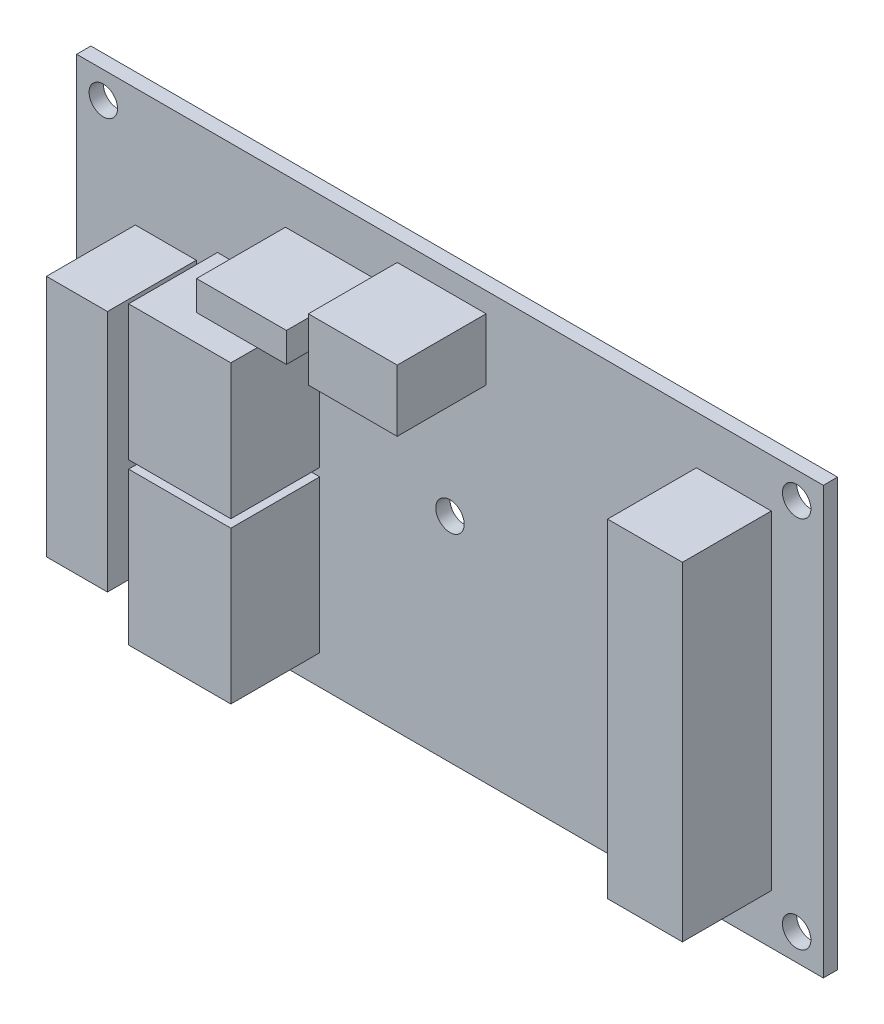
ISO-10303-21;
HEADER;
FILE_DESCRIPTION(('STEP AP214'),'2;1');
FILE_NAME('part.step','',(''),(''),'','','');
FILE_SCHEMA(('AUTOMOTIVE_DESIGN { 1 0 10303 214 1 1 1 1 }'));
ENDSEC;
DATA;
#1=APPLICATION_CONTEXT('core data for automotive mechanical design processes');
#2=APPLICATION_PROTOCOL_DEFINITION('international standard','automotive_design',2000,#1);
#3=PRODUCT_CONTEXT('',#1,'mechanical');
#4=PRODUCT('Part','Part','',(#3));
#5=PRODUCT_RELATED_PRODUCT_CATEGORY('part','',(#4));
#6=PRODUCT_DEFINITION_FORMATION('','',#4);
#7=PRODUCT_DEFINITION_CONTEXT('part definition',#1,'design');
#8=PRODUCT_DEFINITION('design','',#6,#7);
#9=PRODUCT_DEFINITION_SHAPE('','',#8);
#10=(LENGTH_UNIT() NAMED_UNIT(*) SI_UNIT(.MILLI.,.METRE.));
#11=(NAMED_UNIT(*) PLANE_ANGLE_UNIT() SI_UNIT($,.RADIAN.));
#12=(NAMED_UNIT(*) SI_UNIT($,.STERADIAN.) SOLID_ANGLE_UNIT());
#13=UNCERTAINTY_MEASURE_WITH_UNIT(LENGTH_MEASURE(1.E-05),#10,'distance_accuracy_value','');
#14=(GEOMETRIC_REPRESENTATION_CONTEXT(3) GLOBAL_UNCERTAINTY_ASSIGNED_CONTEXT((#13)) GLOBAL_UNIT_ASSIGNED_CONTEXT((#10,
#11,#12)) REPRESENTATION_CONTEXT('',''));
#15=CARTESIAN_POINT('',(0.,0.,0.));
#16=DIRECTION('',(0.,0.,1.));
#17=DIRECTION('',(1.,0.,0.));
#18=AXIS2_PLACEMENT_3D('',#15,#16,#17);
#19=CARTESIAN_POINT('',(0.,0.,0.8));
#20=DIRECTION('',(0.,0.,1.));
#21=DIRECTION('',(1.,0.,0.));
#22=AXIS2_PLACEMENT_3D('',#19,#20,#21);
#23=PLANE('',#22);
#24=CARTESIAN_POINT('',(-39.,21.,0.8));
#25=DIRECTION('',(0.,0.,1.));
#26=DIRECTION('',(1.,0.,0.));
#27=AXIS2_PLACEMENT_3D('',#24,#25,#26);
#28=CIRCLE('',#27,1.6);
#29=CARTESIAN_POINT('',(-37.4,21.,0.8));
#30=VERTEX_POINT('',#29);
#31=EDGE_CURVE('E395',#30,#30,#28,.T.);
#32=ORIENTED_EDGE('',*,*,#31,.F.);
#33=EDGE_LOOP('',(#32));
#34=FACE_BOUND('',#33,.T.);
#35=CARTESIAN_POINT('',(0.,0.,0.8));
#36=DIRECTION('',(0.,0.,1.));
#37=DIRECTION('',(1.,0.,0.));
#38=AXIS2_PLACEMENT_3D('',#35,#36,#37);
#39=CIRCLE('',#38,1.6);
#40=CARTESIAN_POINT('',(1.6,0.,0.8));
#41=VERTEX_POINT('',#40);
#42=EDGE_CURVE('E401',#41,#41,#39,.T.);
#43=ORIENTED_EDGE('',*,*,#42,.F.);
#44=EDGE_LOOP('',(#43));
#45=FACE_BOUND('',#44,.T.);
#46=CARTESIAN_POINT('',(39.,21.,0.8));
#47=DIRECTION('',(0.,0.,1.));
#48=DIRECTION('',(1.,0.,0.));
#49=AXIS2_PLACEMENT_3D('',#46,#47,#48);
#50=CIRCLE('',#49,1.6);
#51=CARTESIAN_POINT('',(40.6,21.,0.8));
#52=VERTEX_POINT('',#51);
#53=EDGE_CURVE('E407',#52,#52,#50,.T.);
#54=ORIENTED_EDGE('',*,*,#53,.F.);
#55=EDGE_LOOP('',(#54));
#56=FACE_BOUND('',#55,.T.);
#57=CARTESIAN_POINT('',(39.,-21.,0.8));
#58=DIRECTION('',(0.,0.,1.));
#59=DIRECTION('',(1.,0.,0.));
#60=AXIS2_PLACEMENT_3D('',#57,#58,#59);
#61=CIRCLE('',#60,1.6);
#62=CARTESIAN_POINT('',(40.6,-21.,0.8));
#63=VERTEX_POINT('',#62);
#64=EDGE_CURVE('E390',#63,#63,#61,.T.);
#65=ORIENTED_EDGE('',*,*,#64,.F.);
#66=EDGE_LOOP('',(#65));
#67=FACE_BOUND('',#66,.T.);
#68=CARTESIAN_POINT('',(-39.,-21.,0.8));
#69=DIRECTION('',(0.,0.,1.));
#70=DIRECTION('',(1.,0.,0.));
#71=AXIS2_PLACEMENT_3D('',#68,#69,#70);
#72=CIRCLE('',#71,1.6);
#73=CARTESIAN_POINT('',(-37.4,-21.,0.8));
#74=VERTEX_POINT('',#73);
#75=EDGE_CURVE('E394',#74,#74,#72,.T.);
#76=ORIENTED_EDGE('',*,*,#75,.F.);
#77=EDGE_LOOP('',(#76));
#78=FACE_BOUND('',#77,.T.);
#79=DIRECTION('',(0.,-1.,0.));
#80=VECTOR('',#79,1.);
#81=CARTESIAN_POINT('',(-42.,24.,0.8));
#82=LINE('',#81,#80);
#83=CARTESIAN_POINT('',(-42.,24.,0.8));
#84=VERTEX_POINT('',#83);
#85=CARTESIAN_POINT('',(-42.,-24.,0.8));
#86=VERTEX_POINT('',#85);
#87=EDGE_CURVE('E421',#84,#86,#82,.T.);
#88=ORIENTED_EDGE('',*,*,#87,.T.);
#89=DIRECTION('',(1.,0.,0.));
#90=VECTOR('',#89,1.);
#91=CARTESIAN_POINT('',(-42.,-24.,0.8));
#92=LINE('',#91,#90);
#93=CARTESIAN_POINT('',(42.,-24.,0.8));
#94=VERTEX_POINT('',#93);
#95=EDGE_CURVE('E424',#86,#94,#92,.T.);
#96=ORIENTED_EDGE('',*,*,#95,.T.);
#97=DIRECTION('',(0.,1.,0.));
#98=VECTOR('',#97,1.);
#99=CARTESIAN_POINT('',(42.,24.,0.8));
#100=LINE('',#99,#98);
#101=CARTESIAN_POINT('',(42.,24.,0.8));
#102=VERTEX_POINT('',#101);
#103=EDGE_CURVE('E427',#94,#102,#100,.T.);
#104=ORIENTED_EDGE('',*,*,#103,.T.);
#105=DIRECTION('',(-1.,0.,0.));
#106=VECTOR('',#105,1.);
#107=CARTESIAN_POINT('',(-42.,24.,0.8));
#108=LINE('',#107,#106);
#109=EDGE_CURVE('E429',#102,#84,#108,.T.);
#110=ORIENTED_EDGE('',*,*,#109,.T.);
#111=EDGE_LOOP('',(#88,#96,#104,#110));
#112=FACE_BOUND('',#111,.T.);
#113=DIRECTION('',(1.,0.,0.));
#114=VECTOR('',#113,1.);
#115=CARTESIAN_POINT('',(-35.397250685937,-16.6681885271844,0.8));
#116=LINE('',#115,#114);
#117=CARTESIAN_POINT('',(-35.397250685937,-16.6681885271844,0.8));
#118=VERTEX_POINT('',#117);
#119=CARTESIAN_POINT('',(-28.5351315170392,-16.6681885271844,0.8));
#120=VERTEX_POINT('',#119);
#121=EDGE_CURVE('E375',#118,#120,#116,.T.);
#122=ORIENTED_EDGE('',*,*,#121,.F.);
#123=DIRECTION('',(0.,-1.,0.));
#124=VECTOR('',#123,1.);
#125=CARTESIAN_POINT('',(-35.397250685937,-16.6681885271844,0.8));
#126=LINE('',#125,#124);
#127=CARTESIAN_POINT('',(-35.397250685937,10.6639361750477,0.8));
#128=VERTEX_POINT('',#127);
#129=EDGE_CURVE('E361',#128,#118,#126,.T.);
#130=ORIENTED_EDGE('',*,*,#129,.F.);
#131=DIRECTION('',(-1.,0.,0.));
#132=VECTOR('',#131,1.);
#133=CARTESIAN_POINT('',(-35.397250685937,10.6639361750477,0.8));
#134=LINE('',#133,#132);
#135=CARTESIAN_POINT('',(-28.5351315170392,10.6639361750477,0.8));
#136=VERTEX_POINT('',#135);
#137=EDGE_CURVE('E366',#136,#128,#134,.T.);
#138=ORIENTED_EDGE('',*,*,#137,.F.);
#139=DIRECTION('',(0.,1.,0.));
#140=VECTOR('',#139,1.);
#141=CARTESIAN_POINT('',(-28.5351315170392,-16.6681885271844,0.8));
#142=LINE('',#141,#140);
#143=EDGE_CURVE('E377',#120,#136,#142,.T.);
#144=ORIENTED_EDGE('',*,*,#143,.F.);
#145=EDGE_LOOP('',(#122,#130,#138,#144));
#146=FACE_BOUND('',#145,.T.);
#147=DIRECTION('',(1.,0.,0.));
#148=VECTOR('',#147,1.);
#149=CARTESIAN_POINT('',(-18.5116651227524,15.5760843348832,0.8));
#150=LINE('',#149,#148);
#151=CARTESIAN_POINT('',(-18.5116651227524,15.5760843348832,0.8));
#152=VERTEX_POINT('',#151);
#153=CARTESIAN_POINT('',(-8.40103586189882,15.5760843348832,0.8));
#154=VERTEX_POINT('',#153);
#155=EDGE_CURVE('E346',#152,#154,#150,.T.);
#156=ORIENTED_EDGE('',*,*,#155,.F.);
#157=DIRECTION('',(0.,-1.,0.));
#158=VECTOR('',#157,1.);
#159=CARTESIAN_POINT('',(-18.5116651227524,15.5760843348832,0.8));
#160=LINE('',#159,#158);
#161=CARTESIAN_POINT('',(-18.5116651227524,18.8889284426793,0.8));
#162=VERTEX_POINT('',#161);
#163=EDGE_CURVE('E332',#162,#152,#160,.T.);
#164=ORIENTED_EDGE('',*,*,#163,.F.);
#165=DIRECTION('',(-1.,0.,0.));
#166=VECTOR('',#165,1.);
#167=CARTESIAN_POINT('',(-18.5116651227524,18.8889284426793,0.8));
#168=LINE('',#167,#166);
#169=CARTESIAN_POINT('',(-8.40103586189882,18.8889284426793,0.8));
#170=VERTEX_POINT('',#169);
#171=EDGE_CURVE('E337',#170,#162,#168,.T.);
#172=ORIENTED_EDGE('',*,*,#171,.F.);
#173=DIRECTION('',(0.,1.,0.));
#174=VECTOR('',#173,1.);
#175=CARTESIAN_POINT('',(-8.40103586189882,15.5760843348832,0.8));
#176=LINE('',#175,#174);
#177=EDGE_CURVE('E348',#154,#170,#176,.T.);
#178=ORIENTED_EDGE('',*,*,#177,.F.);
#179=EDGE_LOOP('',(#156,#164,#172,#178));
#180=FACE_BOUND('',#179,.T.);
#181=DIRECTION('',(1.,0.,0.));
#182=VECTOR('',#181,1.);
#183=CARTESIAN_POINT('',(-5.93226889267909,14.801458918146,0.8));
#184=LINE('',#183,#182);
#185=CARTESIAN_POINT('',(-5.93226889267909,14.801458918146,0.8));
#186=VERTEX_POINT('',#185);
#187=CARTESIAN_POINT('',(4.06338143256795,14.801458918146,0.8));
#188=VERTEX_POINT('',#187);
#189=EDGE_CURVE('E317',#186,#188,#184,.T.);
#190=ORIENTED_EDGE('',*,*,#189,.F.);
#191=DIRECTION('',(0.,-1.,0.));
#192=VECTOR('',#191,1.);
#193=CARTESIAN_POINT('',(-5.93226889267909,14.801458918146,0.8));
#194=LINE('',#193,#192);
#195=CARTESIAN_POINT('',(-5.93226889267909,21.7448285356069,0.8));
#196=VERTEX_POINT('',#195);
#197=EDGE_CURVE('E303',#196,#186,#194,.T.);
#198=ORIENTED_EDGE('',*,*,#197,.F.);
#199=DIRECTION('',(-1.,0.,0.));
#200=VECTOR('',#199,1.);
#201=CARTESIAN_POINT('',(-5.93226889267909,21.7448285356069,0.8));
#202=LINE('',#201,#200);
#203=CARTESIAN_POINT('',(4.06338143256795,21.7448285356069,0.8));
#204=VERTEX_POINT('',#203);
#205=EDGE_CURVE('E308',#204,#196,#202,.T.);
#206=ORIENTED_EDGE('',*,*,#205,.F.);
#207=DIRECTION('',(0.,1.,0.));
#208=VECTOR('',#207,1.);
#209=CARTESIAN_POINT('',(4.06338143256795,14.801458918146,0.8));
#210=LINE('',#209,#208);
#211=EDGE_CURVE('E319',#188,#204,#210,.T.);
#212=ORIENTED_EDGE('',*,*,#211,.F.);
#213=EDGE_LOOP('',(#190,#198,#206,#212));
#214=FACE_BOUND('',#213,.T.);
#215=DIRECTION('',(1.,0.,0.));
#216=VECTOR('',#215,1.);
#217=CARTESIAN_POINT('',(-26.155214772933,-20.6367288434401,0.8));
#218=LINE('',#217,#216);
#219=CARTESIAN_POINT('',(-26.155214772933,-20.6367288434401,0.8));
#220=VERTEX_POINT('',#219);
#221=CARTESIAN_POINT('',(-14.6522838430851,-20.6367288434401,0.8));
#222=VERTEX_POINT('',#221);
#223=EDGE_CURVE('E288',#220,#222,#218,.T.);
#224=ORIENTED_EDGE('',*,*,#223,.F.);
#225=DIRECTION('',(0.,-1.,0.));
#226=VECTOR('',#225,1.);
#227=CARTESIAN_POINT('',(-26.155214772933,-20.6367288434401,0.8));
#228=LINE('',#227,#226);
#229=CARTESIAN_POINT('',(-26.155214772933,-3.50132828587382,0.8));
#230=VERTEX_POINT('',#229);
#231=EDGE_CURVE('E274',#230,#220,#228,.T.);
#232=ORIENTED_EDGE('',*,*,#231,.F.);
#233=DIRECTION('',(-1.,0.,0.));
#234=VECTOR('',#233,1.);
#235=CARTESIAN_POINT('',(-26.155214772933,-3.50132828587382,0.8));
#236=LINE('',#235,#234);
#237=CARTESIAN_POINT('',(-14.6522838430851,-3.50132828587382,0.8));
#238=VERTEX_POINT('',#237);
#239=EDGE_CURVE('E279',#238,#230,#236,.T.);
#240=ORIENTED_EDGE('',*,*,#239,.F.);
#241=DIRECTION('',(0.,1.,0.));
#242=VECTOR('',#241,1.);
#243=CARTESIAN_POINT('',(-14.6522838430851,-20.6367288434401,0.8));
#244=LINE('',#243,#242);
#245=EDGE_CURVE('E290',#222,#238,#244,.T.);
#246=ORIENTED_EDGE('',*,*,#245,.F.);
#247=EDGE_LOOP('',(#224,#232,#240,#246));
#248=FACE_BOUND('',#247,.T.);
#249=DIRECTION('',(1.,0.,0.));
#250=VECTOR('',#249,1.);
#251=CARTESIAN_POINT('',(-26.1552147729329,-2.58744025613696,0.8));
#252=LINE('',#251,#250);
#253=CARTESIAN_POINT('',(-26.1552147729329,-2.58744025613696,0.8));
#254=VERTEX_POINT('',#253);
#255=CARTESIAN_POINT('',(-14.6522838430851,-2.58744025613696,0.8));
#256=VERTEX_POINT('',#255);
#257=EDGE_CURVE('E246',#254,#256,#252,.T.);
#258=ORIENTED_EDGE('',*,*,#257,.F.);
#259=DIRECTION('',(0.,-1.,0.));
#260=VECTOR('',#259,1.);
#261=CARTESIAN_POINT('',(-26.1552147729329,-2.58744025613696,0.8));
#262=LINE('',#261,#260);
#263=CARTESIAN_POINT('',(-26.1552147729329,12.6059482382385,0.8));
#264=VERTEX_POINT('',#263);
#265=EDGE_CURVE('E243',#264,#254,#262,.T.);
#266=ORIENTED_EDGE('',*,*,#265,.F.);
#267=DIRECTION('',(-1.,0.,0.));
#268=VECTOR('',#267,1.);
#269=CARTESIAN_POINT('',(-26.1552147729329,12.6059482382385,0.8));
#270=LINE('',#269,#268);
#271=CARTESIAN_POINT('',(-14.6522838430851,12.6059482382385,0.8));
#272=VERTEX_POINT('',#271);
#273=EDGE_CURVE('E255',#272,#264,#270,.T.);
#274=ORIENTED_EDGE('',*,*,#273,.F.);
#275=DIRECTION('',(0.,1.,0.));
#276=VECTOR('',#275,1.);
#277=CARTESIAN_POINT('',(-14.6522838430851,-2.58744025613696,0.8));
#278=LINE('',#277,#276);
#279=EDGE_CURVE('E263',#256,#272,#278,.T.);
#280=ORIENTED_EDGE('',*,*,#279,.F.);
#281=EDGE_LOOP('',(#258,#266,#274,#280));
#282=FACE_BOUND('',#281,.T.);
#283=DIRECTION('',(1.,0.,0.));
#284=VECTOR('',#283,1.);
#285=CARTESIAN_POINT('',(27.7283273445288,-18.4133300847137,0.8));
#286=LINE('',#285,#284);
#287=CARTESIAN_POINT('',(27.7283273445288,-18.4133300847137,0.8));
#288=VERTEX_POINT('',#287);
#289=CARTESIAN_POINT('',(36.1489259213258,-18.4133300847137,0.8));
#290=VERTEX_POINT('',#289);
#291=EDGE_CURVE('E864',#288,#290,#286,.T.);
#292=ORIENTED_EDGE('',*,*,#291,.F.);
#293=DIRECTION('',(0.,-1.,0.));
#294=VECTOR('',#293,1.);
#295=CARTESIAN_POINT('',(27.7283273445288,-18.4133300847137,0.8));
#296=LINE('',#295,#294);
#297=CARTESIAN_POINT('',(27.7283273445288,18.5743459068227,0.8));
#298=VERTEX_POINT('',#297);
#299=EDGE_CURVE('E241',#298,#288,#296,.T.);
#300=ORIENTED_EDGE('',*,*,#299,.F.);
#301=DIRECTION('',(-1.,0.,0.));
#302=VECTOR('',#301,1.);
#303=CARTESIAN_POINT('',(27.7283273445288,18.5743459068227,0.8));
#304=LINE('',#303,#302);
#305=CARTESIAN_POINT('',(36.1489259213258,18.5743459068227,0.8));
#306=VERTEX_POINT('',#305);
#307=EDGE_CURVE('E237',#306,#298,#304,.T.);
#308=ORIENTED_EDGE('',*,*,#307,.F.);
#309=DIRECTION('',(0.,1.,0.));
#310=VECTOR('',#309,1.);
#311=CARTESIAN_POINT('',(36.1489259213258,-18.4133300847137,0.8));
#312=LINE('',#311,#310);
#313=EDGE_CURVE('E861',#290,#306,#312,.T.);
#314=ORIENTED_EDGE('',*,*,#313,.F.);
#315=EDGE_LOOP('',(#292,#300,#308,#314));
#316=FACE_BOUND('',#315,.T.);
#317=ADVANCED_FACE('F32',(#34,#45,#56,#67,#78,#112,#146,#180,#214,#248,#282,#316),#23,.T.);
#318=CARTESIAN_POINT('',(-42.,24.,0.8));
#319=DIRECTION('',(1.,0.,0.));
#320=DIRECTION('',(0.,1.,0.));
#321=AXIS2_PLACEMENT_3D('',#318,#319,#320);
#322=PLANE('',#321);
#323=DIRECTION('',(0.,-1.,0.));
#324=VECTOR('',#323,1.);
#325=CARTESIAN_POINT('',(-42.,24.,-0.8));
#326=LINE('',#325,#324);
#327=CARTESIAN_POINT('',(-42.,24.,-0.8));
#328=VERTEX_POINT('',#327);
#329=CARTESIAN_POINT('',(-42.,-24.,-0.8));
#330=VERTEX_POINT('',#329);
#331=EDGE_CURVE('E418',#328,#330,#326,.T.);
#332=ORIENTED_EDGE('',*,*,#331,.T.);
#333=DIRECTION('',(0.,0.,-1.));
#334=VECTOR('',#333,1.);
#335=CARTESIAN_POINT('',(-42.,-24.,0.8));
#336=LINE('',#335,#334);
#337=EDGE_CURVE('E11',#86,#330,#336,.T.);
#338=ORIENTED_EDGE('',*,*,#337,.F.);
#339=ORIENTED_EDGE('',*,*,#87,.F.);
#340=DIRECTION('',(0.,0.,-1.));
#341=VECTOR('',#340,1.);
#342=CARTESIAN_POINT('',(-42.,24.,0.8));
#343=LINE('',#342,#341);
#344=EDGE_CURVE('E431',#84,#328,#343,.T.);
#345=ORIENTED_EDGE('',*,*,#344,.T.);
#346=EDGE_LOOP('',(#332,#338,#339,#345));
#347=FACE_BOUND('',#346,.T.);
#348=ADVANCED_FACE('F34',(#347),#322,.F.);
#349=CARTESIAN_POINT('',(-42.,-24.,0.8));
#350=DIRECTION('',(0.,1.,0.));
#351=DIRECTION('',(0.,0.,1.));
#352=AXIS2_PLACEMENT_3D('',#349,#350,#351);
#353=PLANE('',#352);
#354=DIRECTION('',(1.,0.,0.));
#355=VECTOR('',#354,1.);
#356=CARTESIAN_POINT('',(-42.,-24.,-0.8));
#357=LINE('',#356,#355);
#358=CARTESIAN_POINT('',(42.,-24.,-0.8));
#359=VERTEX_POINT('',#358);
#360=EDGE_CURVE('E434',#330,#359,#357,.T.);
#361=ORIENTED_EDGE('',*,*,#360,.T.);
#362=DIRECTION('',(0.,0.,-1.));
#363=VECTOR('',#362,1.);
#364=CARTESIAN_POINT('',(42.,-24.,0.8));
#365=LINE('',#364,#363);
#366=EDGE_CURVE('E40',#94,#359,#365,.T.);
#367=ORIENTED_EDGE('',*,*,#366,.F.);
#368=ORIENTED_EDGE('',*,*,#95,.F.);
#369=ORIENTED_EDGE('',*,*,#337,.T.);
#370=EDGE_LOOP('',(#361,#367,#368,#369));
#371=FACE_BOUND('',#370,.T.);
#372=ADVANCED_FACE('F464',(#371),#353,.F.);
#373=CARTESIAN_POINT('',(42.,24.,0.8));
#374=DIRECTION('',(-1.,0.,0.));
#375=DIRECTION('',(0.,-1.,0.));
#376=AXIS2_PLACEMENT_3D('',#373,#374,#375);
#377=PLANE('',#376);
#378=DIRECTION('',(0.,1.,0.));
#379=VECTOR('',#378,1.);
#380=CARTESIAN_POINT('',(42.,24.,-0.8));
#381=LINE('',#380,#379);
#382=CARTESIAN_POINT('',(42.,24.,-0.8));
#383=VERTEX_POINT('',#382);
#384=EDGE_CURVE('E436',#359,#383,#381,.T.);
#385=ORIENTED_EDGE('',*,*,#384,.T.);
#386=DIRECTION('',(0.,0.,-1.));
#387=VECTOR('',#386,1.);
#388=CARTESIAN_POINT('',(42.,24.,0.8));
#389=LINE('',#388,#387);
#390=EDGE_CURVE('E441',#102,#383,#389,.T.);
#391=ORIENTED_EDGE('',*,*,#390,.F.);
#392=ORIENTED_EDGE('',*,*,#103,.F.);
#393=ORIENTED_EDGE('',*,*,#366,.T.);
#394=EDGE_LOOP('',(#385,#391,#392,#393));
#395=FACE_BOUND('',#394,.T.);
#396=ADVANCED_FACE('F448',(#395),#377,.F.);
#397=CARTESIAN_POINT('',(-42.,24.,0.8));
#398=DIRECTION('',(0.,-1.,0.));
#399=DIRECTION('',(0.,0.,-1.));
#400=AXIS2_PLACEMENT_3D('',#397,#398,#399);
#401=PLANE('',#400);
#402=DIRECTION('',(-1.,0.,0.));
#403=VECTOR('',#402,1.);
#404=CARTESIAN_POINT('',(-42.,24.,-0.8));
#405=LINE('',#404,#403);
#406=EDGE_CURVE('E425',#383,#328,#405,.T.);
#407=ORIENTED_EDGE('',*,*,#406,.T.);
#408=ORIENTED_EDGE('',*,*,#344,.F.);
#409=ORIENTED_EDGE('',*,*,#109,.F.);
#410=ORIENTED_EDGE('',*,*,#390,.T.);
#411=EDGE_LOOP('',(#407,#408,#409,#410));
#412=FACE_BOUND('',#411,.T.);
#413=ADVANCED_FACE('F457',(#412),#401,.F.);
#414=CARTESIAN_POINT('',(0.,0.,-0.8));
#415=DIRECTION('',(0.,0.,1.));
#416=DIRECTION('',(1.,0.,0.));
#417=AXIS2_PLACEMENT_3D('',#414,#415,#416);
#418=PLANE('',#417);
#419=CARTESIAN_POINT('',(-39.,21.,-0.8));
#420=DIRECTION('',(0.,0.,1.));
#421=DIRECTION('',(1.,0.,0.));
#422=AXIS2_PLACEMENT_3D('',#419,#420,#421);
#423=CIRCLE('',#422,1.6);
#424=CARTESIAN_POINT('',(-37.4,21.,-0.8));
#425=VERTEX_POINT('',#424);
#426=EDGE_CURVE('E391',#425,#425,#423,.T.);
#427=ORIENTED_EDGE('',*,*,#426,.T.);
#428=EDGE_LOOP('',(#427));
#429=FACE_BOUND('',#428,.T.);
#430=CARTESIAN_POINT('',(0.,0.,-0.8));
#431=DIRECTION('',(0.,0.,1.));
#432=DIRECTION('',(1.,0.,0.));
#433=AXIS2_PLACEMENT_3D('',#430,#431,#432);
#434=CIRCLE('',#433,1.6);
#435=CARTESIAN_POINT('',(1.6,0.,-0.8));
#436=VERTEX_POINT('',#435);
#437=EDGE_CURVE('E398',#436,#436,#434,.T.);
#438=ORIENTED_EDGE('',*,*,#437,.T.);
#439=EDGE_LOOP('',(#438));
#440=FACE_BOUND('',#439,.T.);
#441=CARTESIAN_POINT('',(39.,21.,-0.8));
#442=DIRECTION('',(0.,0.,1.));
#443=DIRECTION('',(1.,0.,0.));
#444=AXIS2_PLACEMENT_3D('',#441,#442,#443);
#445=CIRCLE('',#444,1.6);
#446=CARTESIAN_POINT('',(40.6,21.,-0.8));
#447=VERTEX_POINT('',#446);
#448=EDGE_CURVE('E404',#447,#447,#445,.T.);
#449=ORIENTED_EDGE('',*,*,#448,.T.);
#450=EDGE_LOOP('',(#449));
#451=FACE_BOUND('',#450,.T.);
#452=CARTESIAN_POINT('',(39.,-21.,-0.8));
#453=DIRECTION('',(0.,0.,1.));
#454=DIRECTION('',(1.,0.,0.));
#455=AXIS2_PLACEMENT_3D('',#452,#453,#454);
#456=CIRCLE('',#455,1.6);
#457=CARTESIAN_POINT('',(40.6,-21.,-0.8));
#458=VERTEX_POINT('',#457);
#459=EDGE_CURVE('E410',#458,#458,#456,.T.);
#460=ORIENTED_EDGE('',*,*,#459,.T.);
#461=EDGE_LOOP('',(#460));
#462=FACE_BOUND('',#461,.T.);
#463=CARTESIAN_POINT('',(-39.,-21.,-0.8));
#464=DIRECTION('',(0.,0.,1.));
#465=DIRECTION('',(1.,0.,0.));
#466=AXIS2_PLACEMENT_3D('',#463,#464,#465);
#467=CIRCLE('',#466,1.6);
#468=CARTESIAN_POINT('',(-37.4,-21.,-0.8));
#469=VERTEX_POINT('',#468);
#470=EDGE_CURVE('E415',#469,#469,#467,.T.);
#471=ORIENTED_EDGE('',*,*,#470,.T.);
#472=EDGE_LOOP('',(#471));
#473=FACE_BOUND('',#472,.T.);
#474=ORIENTED_EDGE('',*,*,#331,.F.);
#475=ORIENTED_EDGE('',*,*,#406,.F.);
#476=ORIENTED_EDGE('',*,*,#384,.F.);
#477=ORIENTED_EDGE('',*,*,#360,.F.);
#478=EDGE_LOOP('',(#474,#475,#476,#477));
#479=FACE_BOUND('',#478,.T.);
#480=ADVANCED_FACE('F454',(#429,#440,#451,#462,#473,#479),#418,.F.);
#481=CARTESIAN_POINT('',(-39.,-21.,-0.8));
#482=DIRECTION('',(0.,0.,1.));
#483=DIRECTION('',(1.,0.,0.));
#484=AXIS2_PLACEMENT_3D('',#481,#482,#483);
#485=CYLINDRICAL_SURFACE('',#484,1.6);
#486=ORIENTED_EDGE('',*,*,#470,.F.);
#487=EDGE_LOOP('',(#486));
#488=FACE_BOUND('',#487,.T.);
#489=ORIENTED_EDGE('',*,*,#75,.T.);
#490=EDGE_LOOP('',(#489));
#491=FACE_BOUND('',#490,.T.);
#492=ADVANCED_FACE('F480',(#488,#491),#485,.F.);
#493=CARTESIAN_POINT('',(39.,-21.,-0.8));
#494=DIRECTION('',(0.,0.,1.));
#495=DIRECTION('',(1.,0.,0.));
#496=AXIS2_PLACEMENT_3D('',#493,#494,#495);
#497=CYLINDRICAL_SURFACE('',#496,1.6);
#498=ORIENTED_EDGE('',*,*,#459,.F.);
#499=EDGE_LOOP('',(#498));
#500=FACE_BOUND('',#499,.T.);
#501=ORIENTED_EDGE('',*,*,#64,.T.);
#502=EDGE_LOOP('',(#501));
#503=FACE_BOUND('',#502,.T.);
#504=ADVANCED_FACE('F500',(#500,#503),#497,.F.);
#505=CARTESIAN_POINT('',(39.,21.,-0.8));
#506=DIRECTION('',(0.,0.,1.));
#507=DIRECTION('',(1.,0.,0.));
#508=AXIS2_PLACEMENT_3D('',#505,#506,#507);
#509=CYLINDRICAL_SURFACE('',#508,1.6);
#510=ORIENTED_EDGE('',*,*,#448,.F.);
#511=EDGE_LOOP('',(#510));
#512=FACE_BOUND('',#511,.T.);
#513=ORIENTED_EDGE('',*,*,#53,.T.);
#514=EDGE_LOOP('',(#513));
#515=FACE_BOUND('',#514,.T.);
#516=ADVANCED_FACE('F507',(#512,#515),#509,.F.);
#517=CARTESIAN_POINT('',(0.,0.,-0.8));
#518=DIRECTION('',(0.,0.,1.));
#519=DIRECTION('',(1.,0.,0.));
#520=AXIS2_PLACEMENT_3D('',#517,#518,#519);
#521=CYLINDRICAL_SURFACE('',#520,1.6);
#522=ORIENTED_EDGE('',*,*,#437,.F.);
#523=EDGE_LOOP('',(#522));
#524=FACE_BOUND('',#523,.T.);
#525=ORIENTED_EDGE('',*,*,#42,.T.);
#526=EDGE_LOOP('',(#525));
#527=FACE_BOUND('',#526,.T.);
#528=ADVANCED_FACE('F514',(#524,#527),#521,.F.);
#529=CARTESIAN_POINT('',(-39.,21.,-0.8));
#530=DIRECTION('',(0.,0.,1.));
#531=DIRECTION('',(1.,0.,0.));
#532=AXIS2_PLACEMENT_3D('',#529,#530,#531);
#533=CYLINDRICAL_SURFACE('',#532,1.6);
#534=ORIENTED_EDGE('',*,*,#426,.F.);
#535=EDGE_LOOP('',(#534));
#536=FACE_BOUND('',#535,.T.);
#537=ORIENTED_EDGE('',*,*,#31,.T.);
#538=EDGE_LOOP('',(#537));
#539=FACE_BOUND('',#538,.T.);
#540=ADVANCED_FACE('F522',(#536,#539),#533,.F.);
#541=CARTESIAN_POINT('',(-35.397250685937,-16.6681885271844,10.8));
#542=DIRECTION('',(1.,0.,0.));
#543=DIRECTION('',(0.,0.,-1.));
#544=AXIS2_PLACEMENT_3D('',#541,#542,#543);
#545=PLANE('',#544);
#546=ORIENTED_EDGE('',*,*,#129,.T.);
#547=DIRECTION('',(0.,0.,-1.));
#548=VECTOR('',#547,1.);
#549=CARTESIAN_POINT('',(-35.397250685937,-16.6681885271844,10.8));
#550=LINE('',#549,#548);
#551=CARTESIAN_POINT('',(-35.397250685937,-16.6681885271844,10.8));
#552=VERTEX_POINT('',#551);
#553=EDGE_CURVE('E388',#552,#118,#550,.T.);
#554=ORIENTED_EDGE('',*,*,#553,.F.);
#555=DIRECTION('',(0.,-1.,0.));
#556=VECTOR('',#555,1.);
#557=CARTESIAN_POINT('',(-35.397250685937,-16.6681885271844,10.8));
#558=LINE('',#557,#556);
#559=CARTESIAN_POINT('',(-35.397250685937,10.6639361750477,10.8));
#560=VERTEX_POINT('',#559);
#561=EDGE_CURVE('E362',#560,#552,#558,.T.);
#562=ORIENTED_EDGE('',*,*,#561,.F.);
#563=DIRECTION('',(0.,0.,-1.));
#564=VECTOR('',#563,1.);
#565=CARTESIAN_POINT('',(-35.397250685937,10.6639361750477,10.8));
#566=LINE('',#565,#564);
#567=EDGE_CURVE('E372',#560,#128,#566,.T.);
#568=ORIENTED_EDGE('',*,*,#567,.T.);
#569=EDGE_LOOP('',(#546,#554,#562,#568));
#570=FACE_BOUND('',#569,.T.);
#571=ADVANCED_FACE('F530',(#570),#545,.F.);
#572=CARTESIAN_POINT('',(-35.397250685937,-16.6681885271844,10.8));
#573=DIRECTION('',(0.,1.,0.));
#574=DIRECTION('',(0.,0.,1.));
#575=AXIS2_PLACEMENT_3D('',#572,#573,#574);
#576=PLANE('',#575);
#577=ORIENTED_EDGE('',*,*,#121,.T.);
#578=DIRECTION('',(0.,0.,-1.));
#579=VECTOR('',#578,1.);
#580=CARTESIAN_POINT('',(-28.5351315170392,-16.6681885271844,10.8));
#581=LINE('',#580,#579);
#582=CARTESIAN_POINT('',(-28.5351315170392,-16.6681885271844,10.8));
#583=VERTEX_POINT('',#582);
#584=EDGE_CURVE('E385',#583,#120,#581,.T.);
#585=ORIENTED_EDGE('',*,*,#584,.F.);
#586=DIRECTION('',(1.,0.,0.));
#587=VECTOR('',#586,1.);
#588=CARTESIAN_POINT('',(-35.397250685937,-16.6681885271844,10.8));
#589=LINE('',#588,#587);
#590=EDGE_CURVE('E365',#552,#583,#589,.T.);
#591=ORIENTED_EDGE('',*,*,#590,.F.);
#592=ORIENTED_EDGE('',*,*,#553,.T.);
#593=EDGE_LOOP('',(#577,#585,#591,#592));
#594=FACE_BOUND('',#593,.T.);
#595=ADVANCED_FACE('F538',(#594),#576,.F.);
#596=CARTESIAN_POINT('',(-28.5351315170392,-16.6681885271844,10.8));
#597=DIRECTION('',(-1.,0.,0.));
#598=DIRECTION('',(0.,0.,1.));
#599=AXIS2_PLACEMENT_3D('',#596,#597,#598);
#600=PLANE('',#599);
#601=ORIENTED_EDGE('',*,*,#143,.T.);
#602=DIRECTION('',(0.,0.,-1.));
#603=VECTOR('',#602,1.);
#604=CARTESIAN_POINT('',(-28.5351315170392,10.6639361750477,10.8));
#605=LINE('',#604,#603);
#606=CARTESIAN_POINT('',(-28.5351315170392,10.6639361750477,10.8));
#607=VERTEX_POINT('',#606);
#608=EDGE_CURVE('E383',#607,#136,#605,.T.);
#609=ORIENTED_EDGE('',*,*,#608,.F.);
#610=DIRECTION('',(0.,1.,0.));
#611=VECTOR('',#610,1.);
#612=CARTESIAN_POINT('',(-28.5351315170392,-16.6681885271844,10.8));
#613=LINE('',#612,#611);
#614=EDGE_CURVE('E368',#583,#607,#613,.T.);
#615=ORIENTED_EDGE('',*,*,#614,.F.);
#616=ORIENTED_EDGE('',*,*,#584,.T.);
#617=EDGE_LOOP('',(#601,#609,#615,#616));
#618=FACE_BOUND('',#617,.T.);
#619=ADVANCED_FACE('F546',(#618),#600,.F.);
#620=CARTESIAN_POINT('',(-35.397250685937,10.6639361750477,10.8));
#621=DIRECTION('',(0.,-1.,0.));
#622=DIRECTION('',(0.,0.,-1.));
#623=AXIS2_PLACEMENT_3D('',#620,#621,#622);
#624=PLANE('',#623);
#625=ORIENTED_EDGE('',*,*,#137,.T.);
#626=ORIENTED_EDGE('',*,*,#567,.F.);
#627=DIRECTION('',(-1.,0.,0.));
#628=VECTOR('',#627,1.);
#629=CARTESIAN_POINT('',(-35.397250685937,10.6639361750477,10.8));
#630=LINE('',#629,#628);
#631=EDGE_CURVE('E370',#607,#560,#630,.T.);
#632=ORIENTED_EDGE('',*,*,#631,.F.);
#633=ORIENTED_EDGE('',*,*,#608,.T.);
#634=EDGE_LOOP('',(#625,#626,#632,#633));
#635=FACE_BOUND('',#634,.T.);
#636=ADVANCED_FACE('F554',(#635),#624,.F.);
#637=CARTESIAN_POINT('',(0.,0.,10.8));
#638=DIRECTION('',(0.,0.,-1.));
#639=DIRECTION('',(-1.,0.,0.));
#640=AXIS2_PLACEMENT_3D('',#637,#638,#639);
#641=PLANE('',#640);
#642=ORIENTED_EDGE('',*,*,#561,.T.);
#643=ORIENTED_EDGE('',*,*,#590,.T.);
#644=ORIENTED_EDGE('',*,*,#614,.T.);
#645=ORIENTED_EDGE('',*,*,#631,.T.);
#646=EDGE_LOOP('',(#642,#643,#644,#645));
#647=FACE_BOUND('',#646,.T.);
#648=ADVANCED_FACE('F562',(#647),#641,.F.);
#649=CARTESIAN_POINT('',(-18.5116651227524,15.5760843348832,10.8));
#650=DIRECTION('',(1.,0.,0.));
#651=DIRECTION('',(0.,0.,-1.));
#652=AXIS2_PLACEMENT_3D('',#649,#650,#651);
#653=PLANE('',#652);
#654=ORIENTED_EDGE('',*,*,#163,.T.);
#655=DIRECTION('',(0.,0.,-1.));
#656=VECTOR('',#655,1.);
#657=CARTESIAN_POINT('',(-18.5116651227524,15.5760843348832,10.8));
#658=LINE('',#657,#656);
#659=CARTESIAN_POINT('',(-18.5116651227524,15.5760843348832,10.8));
#660=VERTEX_POINT('',#659);
#661=EDGE_CURVE('E359',#660,#152,#658,.T.);
#662=ORIENTED_EDGE('',*,*,#661,.F.);
#663=DIRECTION('',(0.,-1.,0.));
#664=VECTOR('',#663,1.);
#665=CARTESIAN_POINT('',(-18.5116651227524,15.5760843348832,10.8));
#666=LINE('',#665,#664);
#667=CARTESIAN_POINT('',(-18.5116651227524,18.8889284426793,10.8));
#668=VERTEX_POINT('',#667);
#669=EDGE_CURVE('E333',#668,#660,#666,.T.);
#670=ORIENTED_EDGE('',*,*,#669,.F.);
#671=DIRECTION('',(0.,0.,-1.));
#672=VECTOR('',#671,1.);
#673=CARTESIAN_POINT('',(-18.5116651227524,18.8889284426793,10.8));
#674=LINE('',#673,#672);
#675=EDGE_CURVE('E343',#668,#162,#674,.T.);
#676=ORIENTED_EDGE('',*,*,#675,.T.);
#677=EDGE_LOOP('',(#654,#662,#670,#676));
#678=FACE_BOUND('',#677,.T.);
#679=ADVANCED_FACE('F570',(#678),#653,.F.);
#680=CARTESIAN_POINT('',(-18.5116651227524,15.5760843348832,10.8));
#681=DIRECTION('',(0.,1.,0.));
#682=DIRECTION('',(0.,0.,1.));
#683=AXIS2_PLACEMENT_3D('',#680,#681,#682);
#684=PLANE('',#683);
#685=ORIENTED_EDGE('',*,*,#155,.T.);
#686=DIRECTION('',(0.,0.,-1.));
#687=VECTOR('',#686,1.);
#688=CARTESIAN_POINT('',(-8.40103586189882,15.5760843348832,10.8));
#689=LINE('',#688,#687);
#690=CARTESIAN_POINT('',(-8.40103586189882,15.5760843348832,10.8));
#691=VERTEX_POINT('',#690);
#692=EDGE_CURVE('E356',#691,#154,#689,.T.);
#693=ORIENTED_EDGE('',*,*,#692,.F.);
#694=DIRECTION('',(1.,0.,0.));
#695=VECTOR('',#694,1.);
#696=CARTESIAN_POINT('',(-18.5116651227524,15.5760843348832,10.8));
#697=LINE('',#696,#695);
#698=EDGE_CURVE('E336',#660,#691,#697,.T.);
#699=ORIENTED_EDGE('',*,*,#698,.F.);
#700=ORIENTED_EDGE('',*,*,#661,.T.);
#701=EDGE_LOOP('',(#685,#693,#699,#700));
#702=FACE_BOUND('',#701,.T.);
#703=ADVANCED_FACE('F578',(#702),#684,.F.);
#704=CARTESIAN_POINT('',(-8.40103586189882,15.5760843348832,10.8));
#705=DIRECTION('',(-1.,0.,0.));
#706=DIRECTION('',(0.,0.,1.));
#707=AXIS2_PLACEMENT_3D('',#704,#705,#706);
#708=PLANE('',#707);
#709=ORIENTED_EDGE('',*,*,#177,.T.);
#710=DIRECTION('',(0.,0.,-1.));
#711=VECTOR('',#710,1.);
#712=CARTESIAN_POINT('',(-8.40103586189882,18.8889284426793,10.8));
#713=LINE('',#712,#711);
#714=CARTESIAN_POINT('',(-8.40103586189882,18.8889284426793,10.8));
#715=VERTEX_POINT('',#714);
#716=EDGE_CURVE('E354',#715,#170,#713,.T.);
#717=ORIENTED_EDGE('',*,*,#716,.F.);
#718=DIRECTION('',(0.,1.,0.));
#719=VECTOR('',#718,1.);
#720=CARTESIAN_POINT('',(-8.40103586189882,15.5760843348832,10.8));
#721=LINE('',#720,#719);
#722=EDGE_CURVE('E339',#691,#715,#721,.T.);
#723=ORIENTED_EDGE('',*,*,#722,.F.);
#724=ORIENTED_EDGE('',*,*,#692,.T.);
#725=EDGE_LOOP('',(#709,#717,#723,#724));
#726=FACE_BOUND('',#725,.T.);
#727=ADVANCED_FACE('F586',(#726),#708,.F.);
#728=CARTESIAN_POINT('',(-18.5116651227524,18.8889284426793,10.8));
#729=DIRECTION('',(0.,-1.,0.));
#730=DIRECTION('',(0.,0.,-1.));
#731=AXIS2_PLACEMENT_3D('',#728,#729,#730);
#732=PLANE('',#731);
#733=ORIENTED_EDGE('',*,*,#171,.T.);
#734=ORIENTED_EDGE('',*,*,#675,.F.);
#735=DIRECTION('',(-1.,0.,0.));
#736=VECTOR('',#735,1.);
#737=CARTESIAN_POINT('',(-18.5116651227524,18.8889284426793,10.8));
#738=LINE('',#737,#736);
#739=EDGE_CURVE('E341',#715,#668,#738,.T.);
#740=ORIENTED_EDGE('',*,*,#739,.F.);
#741=ORIENTED_EDGE('',*,*,#716,.T.);
#742=EDGE_LOOP('',(#733,#734,#740,#741));
#743=FACE_BOUND('',#742,.T.);
#744=ADVANCED_FACE('F594',(#743),#732,.F.);
#745=CARTESIAN_POINT('',(0.,0.,10.8));
#746=DIRECTION('',(0.,0.,-1.));
#747=DIRECTION('',(-1.,0.,0.));
#748=AXIS2_PLACEMENT_3D('',#745,#746,#747);
#749=PLANE('',#748);
#750=ORIENTED_EDGE('',*,*,#669,.T.);
#751=ORIENTED_EDGE('',*,*,#698,.T.);
#752=ORIENTED_EDGE('',*,*,#722,.T.);
#753=ORIENTED_EDGE('',*,*,#739,.T.);
#754=EDGE_LOOP('',(#750,#751,#752,#753));
#755=FACE_BOUND('',#754,.T.);
#756=ADVANCED_FACE('F602',(#755),#749,.F.);
#757=CARTESIAN_POINT('',(-5.93226889267909,14.801458918146,10.8));
#758=DIRECTION('',(1.,0.,0.));
#759=DIRECTION('',(0.,0.,-1.));
#760=AXIS2_PLACEMENT_3D('',#757,#758,#759);
#761=PLANE('',#760);
#762=ORIENTED_EDGE('',*,*,#197,.T.);
#763=DIRECTION('',(0.,0.,-1.));
#764=VECTOR('',#763,1.);
#765=CARTESIAN_POINT('',(-5.93226889267909,14.801458918146,10.8));
#766=LINE('',#765,#764);
#767=CARTESIAN_POINT('',(-5.93226889267909,14.801458918146,10.8));
#768=VERTEX_POINT('',#767);
#769=EDGE_CURVE('E330',#768,#186,#766,.T.);
#770=ORIENTED_EDGE('',*,*,#769,.F.);
#771=DIRECTION('',(0.,-1.,0.));
#772=VECTOR('',#771,1.);
#773=CARTESIAN_POINT('',(-5.93226889267909,14.801458918146,10.8));
#774=LINE('',#773,#772);
#775=CARTESIAN_POINT('',(-5.93226889267909,21.7448285356069,10.8));
#776=VERTEX_POINT('',#775);
#777=EDGE_CURVE('E304',#776,#768,#774,.T.);
#778=ORIENTED_EDGE('',*,*,#777,.F.);
#779=DIRECTION('',(0.,0.,-1.));
#780=VECTOR('',#779,1.);
#781=CARTESIAN_POINT('',(-5.93226889267909,21.7448285356069,10.8));
#782=LINE('',#781,#780);
#783=EDGE_CURVE('E314',#776,#196,#782,.T.);
#784=ORIENTED_EDGE('',*,*,#783,.T.);
#785=EDGE_LOOP('',(#762,#770,#778,#784));
#786=FACE_BOUND('',#785,.T.);
#787=ADVANCED_FACE('F610',(#786),#761,.F.);
#788=CARTESIAN_POINT('',(-5.93226889267909,14.801458918146,10.8));
#789=DIRECTION('',(0.,1.,0.));
#790=DIRECTION('',(0.,0.,1.));
#791=AXIS2_PLACEMENT_3D('',#788,#789,#790);
#792=PLANE('',#791);
#793=ORIENTED_EDGE('',*,*,#189,.T.);
#794=DIRECTION('',(0.,0.,-1.));
#795=VECTOR('',#794,1.);
#796=CARTESIAN_POINT('',(4.06338143256795,14.801458918146,10.8));
#797=LINE('',#796,#795);
#798=CARTESIAN_POINT('',(4.06338143256795,14.801458918146,10.8));
#799=VERTEX_POINT('',#798);
#800=EDGE_CURVE('E327',#799,#188,#797,.T.);
#801=ORIENTED_EDGE('',*,*,#800,.F.);
#802=DIRECTION('',(1.,0.,0.));
#803=VECTOR('',#802,1.);
#804=CARTESIAN_POINT('',(-5.93226889267909,14.801458918146,10.8));
#805=LINE('',#804,#803);
#806=EDGE_CURVE('E307',#768,#799,#805,.T.);
#807=ORIENTED_EDGE('',*,*,#806,.F.);
#808=ORIENTED_EDGE('',*,*,#769,.T.);
#809=EDGE_LOOP('',(#793,#801,#807,#808));
#810=FACE_BOUND('',#809,.T.);
#811=ADVANCED_FACE('F618',(#810),#792,.F.);
#812=CARTESIAN_POINT('',(4.06338143256795,14.801458918146,10.8));
#813=DIRECTION('',(-1.,0.,0.));
#814=DIRECTION('',(0.,0.,1.));
#815=AXIS2_PLACEMENT_3D('',#812,#813,#814);
#816=PLANE('',#815);
#817=ORIENTED_EDGE('',*,*,#211,.T.);
#818=DIRECTION('',(0.,0.,-1.));
#819=VECTOR('',#818,1.);
#820=CARTESIAN_POINT('',(4.06338143256795,21.7448285356069,10.8));
#821=LINE('',#820,#819);
#822=CARTESIAN_POINT('',(4.06338143256795,21.7448285356069,10.8));
#823=VERTEX_POINT('',#822);
#824=EDGE_CURVE('E325',#823,#204,#821,.T.);
#825=ORIENTED_EDGE('',*,*,#824,.F.);
#826=DIRECTION('',(0.,1.,0.));
#827=VECTOR('',#826,1.);
#828=CARTESIAN_POINT('',(4.06338143256795,14.801458918146,10.8));
#829=LINE('',#828,#827);
#830=EDGE_CURVE('E310',#799,#823,#829,.T.);
#831=ORIENTED_EDGE('',*,*,#830,.F.);
#832=ORIENTED_EDGE('',*,*,#800,.T.);
#833=EDGE_LOOP('',(#817,#825,#831,#832));
#834=FACE_BOUND('',#833,.T.);
#835=ADVANCED_FACE('F626',(#834),#816,.F.);
#836=CARTESIAN_POINT('',(-5.93226889267909,21.7448285356069,10.8));
#837=DIRECTION('',(0.,-1.,0.));
#838=DIRECTION('',(0.,0.,-1.));
#839=AXIS2_PLACEMENT_3D('',#836,#837,#838);
#840=PLANE('',#839);
#841=ORIENTED_EDGE('',*,*,#205,.T.);
#842=ORIENTED_EDGE('',*,*,#783,.F.);
#843=DIRECTION('',(-1.,0.,0.));
#844=VECTOR('',#843,1.);
#845=CARTESIAN_POINT('',(-5.93226889267909,21.7448285356069,10.8));
#846=LINE('',#845,#844);
#847=EDGE_CURVE('E312',#823,#776,#846,.T.);
#848=ORIENTED_EDGE('',*,*,#847,.F.);
#849=ORIENTED_EDGE('',*,*,#824,.T.);
#850=EDGE_LOOP('',(#841,#842,#848,#849));
#851=FACE_BOUND('',#850,.T.);
#852=ADVANCED_FACE('F634',(#851),#840,.F.);
#853=CARTESIAN_POINT('',(0.,0.,10.8));
#854=DIRECTION('',(0.,0.,-1.));
#855=DIRECTION('',(-1.,0.,0.));
#856=AXIS2_PLACEMENT_3D('',#853,#854,#855);
#857=PLANE('',#856);
#858=ORIENTED_EDGE('',*,*,#777,.T.);
#859=ORIENTED_EDGE('',*,*,#806,.T.);
#860=ORIENTED_EDGE('',*,*,#830,.T.);
#861=ORIENTED_EDGE('',*,*,#847,.T.);
#862=EDGE_LOOP('',(#858,#859,#860,#861));
#863=FACE_BOUND('',#862,.T.);
#864=ADVANCED_FACE('F642',(#863),#857,.F.);
#865=CARTESIAN_POINT('',(-26.155214772933,-20.6367288434401,10.8));
#866=DIRECTION('',(1.,0.,0.));
#867=DIRECTION('',(0.,0.,-1.));
#868=AXIS2_PLACEMENT_3D('',#865,#866,#867);
#869=PLANE('',#868);
#870=ORIENTED_EDGE('',*,*,#231,.T.);
#871=DIRECTION('',(0.,0.,-1.));
#872=VECTOR('',#871,1.);
#873=CARTESIAN_POINT('',(-26.155214772933,-20.6367288434401,10.8));
#874=LINE('',#873,#872);
#875=CARTESIAN_POINT('',(-26.155214772933,-20.6367288434401,10.8));
#876=VERTEX_POINT('',#875);
#877=EDGE_CURVE('E301',#876,#220,#874,.T.);
#878=ORIENTED_EDGE('',*,*,#877,.F.);
#879=DIRECTION('',(0.,-1.,0.));
#880=VECTOR('',#879,1.);
#881=CARTESIAN_POINT('',(-26.155214772933,-20.6367288434401,10.8));
#882=LINE('',#881,#880);
#883=CARTESIAN_POINT('',(-26.155214772933,-3.50132828587382,10.8));
#884=VERTEX_POINT('',#883);
#885=EDGE_CURVE('E275',#884,#876,#882,.T.);
#886=ORIENTED_EDGE('',*,*,#885,.F.);
#887=DIRECTION('',(0.,0.,-1.));
#888=VECTOR('',#887,1.);
#889=CARTESIAN_POINT('',(-26.155214772933,-3.50132828587382,10.8));
#890=LINE('',#889,#888);
#891=EDGE_CURVE('E285',#884,#230,#890,.T.);
#892=ORIENTED_EDGE('',*,*,#891,.T.);
#893=EDGE_LOOP('',(#870,#878,#886,#892));
#894=FACE_BOUND('',#893,.T.);
#895=ADVANCED_FACE('F650',(#894),#869,.F.);
#896=CARTESIAN_POINT('',(-26.155214772933,-20.6367288434401,10.8));
#897=DIRECTION('',(0.,1.,0.));
#898=DIRECTION('',(0.,0.,1.));
#899=AXIS2_PLACEMENT_3D('',#896,#897,#898);
#900=PLANE('',#899);
#901=ORIENTED_EDGE('',*,*,#223,.T.);
#902=DIRECTION('',(0.,0.,-1.));
#903=VECTOR('',#902,1.);
#904=CARTESIAN_POINT('',(-14.6522838430851,-20.6367288434401,10.8));
#905=LINE('',#904,#903);
#906=CARTESIAN_POINT('',(-14.6522838430851,-20.6367288434401,10.8));
#907=VERTEX_POINT('',#906);
#908=EDGE_CURVE('E298',#907,#222,#905,.T.);
#909=ORIENTED_EDGE('',*,*,#908,.F.);
#910=DIRECTION('',(1.,0.,0.));
#911=VECTOR('',#910,1.);
#912=CARTESIAN_POINT('',(-26.155214772933,-20.6367288434401,10.8));
#913=LINE('',#912,#911);
#914=EDGE_CURVE('E278',#876,#907,#913,.T.);
#915=ORIENTED_EDGE('',*,*,#914,.F.);
#916=ORIENTED_EDGE('',*,*,#877,.T.);
#917=EDGE_LOOP('',(#901,#909,#915,#916));
#918=FACE_BOUND('',#917,.T.);
#919=ADVANCED_FACE('F658',(#918),#900,.F.);
#920=CARTESIAN_POINT('',(-14.6522838430851,-20.6367288434401,10.8));
#921=DIRECTION('',(-1.,0.,0.));
#922=DIRECTION('',(0.,0.,1.));
#923=AXIS2_PLACEMENT_3D('',#920,#921,#922);
#924=PLANE('',#923);
#925=ORIENTED_EDGE('',*,*,#245,.T.);
#926=DIRECTION('',(0.,0.,-1.));
#927=VECTOR('',#926,1.);
#928=CARTESIAN_POINT('',(-14.6522838430851,-3.50132828587382,10.8));
#929=LINE('',#928,#927);
#930=CARTESIAN_POINT('',(-14.6522838430851,-3.50132828587382,10.8));
#931=VERTEX_POINT('',#930);
#932=EDGE_CURVE('E296',#931,#238,#929,.T.);
#933=ORIENTED_EDGE('',*,*,#932,.F.);
#934=DIRECTION('',(0.,1.,0.));
#935=VECTOR('',#934,1.);
#936=CARTESIAN_POINT('',(-14.6522838430851,-20.6367288434401,10.8));
#937=LINE('',#936,#935);
#938=EDGE_CURVE('E281',#907,#931,#937,.T.);
#939=ORIENTED_EDGE('',*,*,#938,.F.);
#940=ORIENTED_EDGE('',*,*,#908,.T.);
#941=EDGE_LOOP('',(#925,#933,#939,#940));
#942=FACE_BOUND('',#941,.T.);
#943=ADVANCED_FACE('F666',(#942),#924,.F.);
#944=CARTESIAN_POINT('',(-26.155214772933,-3.50132828587382,10.8));
#945=DIRECTION('',(0.,-1.,0.));
#946=DIRECTION('',(0.,0.,-1.));
#947=AXIS2_PLACEMENT_3D('',#944,#945,#946);
#948=PLANE('',#947);
#949=ORIENTED_EDGE('',*,*,#239,.T.);
#950=ORIENTED_EDGE('',*,*,#891,.F.);
#951=DIRECTION('',(-1.,0.,0.));
#952=VECTOR('',#951,1.);
#953=CARTESIAN_POINT('',(-26.155214772933,-3.50132828587382,10.8));
#954=LINE('',#953,#952);
#955=EDGE_CURVE('E283',#931,#884,#954,.T.);
#956=ORIENTED_EDGE('',*,*,#955,.F.);
#957=ORIENTED_EDGE('',*,*,#932,.T.);
#958=EDGE_LOOP('',(#949,#950,#956,#957));
#959=FACE_BOUND('',#958,.T.);
#960=ADVANCED_FACE('F674',(#959),#948,.F.);
#961=CARTESIAN_POINT('',(0.,0.,10.8));
#962=DIRECTION('',(0.,0.,-1.));
#963=DIRECTION('',(-1.,0.,0.));
#964=AXIS2_PLACEMENT_3D('',#961,#962,#963);
#965=PLANE('',#964);
#966=ORIENTED_EDGE('',*,*,#885,.T.);
#967=ORIENTED_EDGE('',*,*,#914,.T.);
#968=ORIENTED_EDGE('',*,*,#938,.T.);
#969=ORIENTED_EDGE('',*,*,#955,.T.);
#970=EDGE_LOOP('',(#966,#967,#968,#969));
#971=FACE_BOUND('',#970,.T.);
#972=ADVANCED_FACE('F682',(#971),#965,.F.);
#973=CARTESIAN_POINT('',(-26.1552147729329,-2.58744025613696,10.8));
#974=DIRECTION('',(1.,0.,0.));
#975=DIRECTION('',(0.,0.,-1.));
#976=AXIS2_PLACEMENT_3D('',#973,#974,#975);
#977=PLANE('',#976);
#978=ORIENTED_EDGE('',*,*,#265,.T.);
#979=DIRECTION('',(0.,0.,-1.));
#980=VECTOR('',#979,1.);
#981=CARTESIAN_POINT('',(-26.1552147729329,-2.58744025613696,10.8));
#982=LINE('',#981,#980);
#983=CARTESIAN_POINT('',(-26.1552147729329,-2.58744025613696,10.8));
#984=VERTEX_POINT('',#983);
#985=EDGE_CURVE('E272',#984,#254,#982,.T.);
#986=ORIENTED_EDGE('',*,*,#985,.F.);
#987=DIRECTION('',(0.,-1.,0.));
#988=VECTOR('',#987,1.);
#989=CARTESIAN_POINT('',(-26.1552147729329,-2.58744025613696,10.8));
#990=LINE('',#989,#988);
#991=CARTESIAN_POINT('',(-26.1552147729329,12.6059482382385,10.8));
#992=VERTEX_POINT('',#991);
#993=EDGE_CURVE('E251',#992,#984,#990,.T.);
#994=ORIENTED_EDGE('',*,*,#993,.F.);
#995=DIRECTION('',(0.,0.,-1.));
#996=VECTOR('',#995,1.);
#997=CARTESIAN_POINT('',(-26.1552147729329,12.6059482382385,10.8));
#998=LINE('',#997,#996);
#999=EDGE_CURVE('E260',#992,#264,#998,.T.);
#1000=ORIENTED_EDGE('',*,*,#999,.T.);
#1001=EDGE_LOOP('',(#978,#986,#994,#1000));
#1002=FACE_BOUND('',#1001,.T.);
#1003=ADVANCED_FACE('F690',(#1002),#977,.F.);
#1004=CARTESIAN_POINT('',(-26.1552147729329,-2.58744025613696,10.8));
#1005=DIRECTION('',(0.,1.,0.));
#1006=DIRECTION('',(0.,0.,1.));
#1007=AXIS2_PLACEMENT_3D('',#1004,#1005,#1006);
#1008=PLANE('',#1007);
#1009=ORIENTED_EDGE('',*,*,#257,.T.);
#1010=DIRECTION('',(0.,0.,-1.));
#1011=VECTOR('',#1010,1.);
#1012=CARTESIAN_POINT('',(-14.6522838430851,-2.58744025613696,10.8));
#1013=LINE('',#1012,#1011);
#1014=CARTESIAN_POINT('',(-14.6522838430851,-2.58744025613696,10.8));
#1015=VERTEX_POINT('',#1014);
#1016=EDGE_CURVE('E269',#1015,#256,#1013,.T.);
#1017=ORIENTED_EDGE('',*,*,#1016,.F.);
#1018=DIRECTION('',(1.,0.,0.));
#1019=VECTOR('',#1018,1.);
#1020=CARTESIAN_POINT('',(-26.1552147729329,-2.58744025613696,10.8));
#1021=LINE('',#1020,#1019);
#1022=EDGE_CURVE('E254',#984,#1015,#1021,.T.);
#1023=ORIENTED_EDGE('',*,*,#1022,.F.);
#1024=ORIENTED_EDGE('',*,*,#985,.T.);
#1025=EDGE_LOOP('',(#1009,#1017,#1023,#1024));
#1026=FACE_BOUND('',#1025,.T.);
#1027=ADVANCED_FACE('F698',(#1026),#1008,.F.);
#1028=CARTESIAN_POINT('',(-14.6522838430851,-2.58744025613696,10.8));
#1029=DIRECTION('',(-1.,0.,0.));
#1030=DIRECTION('',(0.,0.,1.));
#1031=AXIS2_PLACEMENT_3D('',#1028,#1029,#1030);
#1032=PLANE('',#1031);
#1033=ORIENTED_EDGE('',*,*,#279,.T.);
#1034=DIRECTION('',(0.,0.,-1.));
#1035=VECTOR('',#1034,1.);
#1036=CARTESIAN_POINT('',(-14.6522838430851,12.6059482382385,10.8));
#1037=LINE('',#1036,#1035);
#1038=CARTESIAN_POINT('',(-14.6522838430851,12.6059482382385,10.8));
#1039=VERTEX_POINT('',#1038);
#1040=EDGE_CURVE('E55',#1039,#272,#1037,.T.);
#1041=ORIENTED_EDGE('',*,*,#1040,.F.);
#1042=DIRECTION('',(0.,1.,0.));
#1043=VECTOR('',#1042,1.);
#1044=CARTESIAN_POINT('',(-14.6522838430851,-2.58744025613696,10.8));
#1045=LINE('',#1044,#1043);
#1046=EDGE_CURVE('E257',#1015,#1039,#1045,.T.);
#1047=ORIENTED_EDGE('',*,*,#1046,.F.);
#1048=ORIENTED_EDGE('',*,*,#1016,.T.);
#1049=EDGE_LOOP('',(#1033,#1041,#1047,#1048));
#1050=FACE_BOUND('',#1049,.T.);
#1051=ADVANCED_FACE('F706',(#1050),#1032,.F.);
#1052=CARTESIAN_POINT('',(-26.1552147729329,12.6059482382385,10.8));
#1053=DIRECTION('',(0.,-1.,0.));
#1054=DIRECTION('',(0.,0.,-1.));
#1055=AXIS2_PLACEMENT_3D('',#1052,#1053,#1054);
#1056=PLANE('',#1055);
#1057=ORIENTED_EDGE('',*,*,#273,.T.);
#1058=ORIENTED_EDGE('',*,*,#999,.F.);
#1059=DIRECTION('',(-1.,0.,0.));
#1060=VECTOR('',#1059,1.);
#1061=CARTESIAN_POINT('',(-26.1552147729329,12.6059482382385,10.8));
#1062=LINE('',#1061,#1060);
#1063=EDGE_CURVE('E259',#1039,#992,#1062,.T.);
#1064=ORIENTED_EDGE('',*,*,#1063,.F.);
#1065=ORIENTED_EDGE('',*,*,#1040,.T.);
#1066=EDGE_LOOP('',(#1057,#1058,#1064,#1065));
#1067=FACE_BOUND('',#1066,.T.);
#1068=ADVANCED_FACE('F714',(#1067),#1056,.F.);
#1069=CARTESIAN_POINT('',(0.,0.,10.8));
#1070=DIRECTION('',(0.,0.,-1.));
#1071=DIRECTION('',(-1.,0.,0.));
#1072=AXIS2_PLACEMENT_3D('',#1069,#1070,#1071);
#1073=PLANE('',#1072);
#1074=ORIENTED_EDGE('',*,*,#993,.T.);
#1075=ORIENTED_EDGE('',*,*,#1022,.T.);
#1076=ORIENTED_EDGE('',*,*,#1046,.T.);
#1077=ORIENTED_EDGE('',*,*,#1063,.T.);
#1078=EDGE_LOOP('',(#1074,#1075,#1076,#1077));
#1079=FACE_BOUND('',#1078,.T.);
#1080=ADVANCED_FACE('F722',(#1079),#1073,.F.);
#1081=CARTESIAN_POINT('',(27.7283273445288,-18.4133300847137,10.8));
#1082=DIRECTION('',(1.,0.,0.));
#1083=DIRECTION('',(0.,0.,-1.));
#1084=AXIS2_PLACEMENT_3D('',#1081,#1082,#1083);
#1085=PLANE('',#1084);
#1086=ORIENTED_EDGE('',*,*,#299,.T.);
#1087=DIRECTION('',(0.,0.,-1.));
#1088=VECTOR('',#1087,1.);
#1089=CARTESIAN_POINT('',(27.7283273445288,-18.4133300847137,10.8));
#1090=LINE('',#1089,#1088);
#1091=CARTESIAN_POINT('',(27.7283273445288,-18.4133300847137,10.8));
#1092=VERTEX_POINT('',#1091);
#1093=EDGE_CURVE('E222',#1092,#288,#1090,.T.);
#1094=ORIENTED_EDGE('',*,*,#1093,.F.);
#1095=DIRECTION('',(0.,-1.,0.));
#1096=VECTOR('',#1095,1.);
#1097=CARTESIAN_POINT('',(27.7283273445288,-18.4133300847137,10.8));
#1098=LINE('',#1097,#1096);
#1099=CARTESIAN_POINT('',(27.7283273445288,18.5743459068227,10.8));
#1100=VERTEX_POINT('',#1099);
#1101=EDGE_CURVE('E229',#1100,#1092,#1098,.T.);
#1102=ORIENTED_EDGE('',*,*,#1101,.F.);
#1103=DIRECTION('',(0.,0.,-1.));
#1104=VECTOR('',#1103,1.);
#1105=CARTESIAN_POINT('',(27.7283273445288,18.5743459068227,10.8));
#1106=LINE('',#1105,#1104);
#1107=EDGE_CURVE('E858',#1100,#298,#1106,.T.);
#1108=ORIENTED_EDGE('',*,*,#1107,.T.);
#1109=EDGE_LOOP('',(#1086,#1094,#1102,#1108));
#1110=FACE_BOUND('',#1109,.T.);
#1111=ADVANCED_FACE('F239',(#1110),#1085,.F.);
#1112=CARTESIAN_POINT('',(27.7283273445288,-18.4133300847137,10.8));
#1113=DIRECTION('',(0.,1.,0.));
#1114=DIRECTION('',(0.,0.,1.));
#1115=AXIS2_PLACEMENT_3D('',#1112,#1113,#1114);
#1116=PLANE('',#1115);
#1117=ORIENTED_EDGE('',*,*,#291,.T.);
#1118=DIRECTION('',(0.,0.,-1.));
#1119=VECTOR('',#1118,1.);
#1120=CARTESIAN_POINT('',(36.1489259213258,-18.4133300847137,10.8));
#1121=LINE('',#1120,#1119);
#1122=CARTESIAN_POINT('',(36.1489259213258,-18.4133300847137,10.8));
#1123=VERTEX_POINT('',#1122);
#1124=EDGE_CURVE('E225',#1123,#290,#1121,.T.);
#1125=ORIENTED_EDGE('',*,*,#1124,.F.);
#1126=DIRECTION('',(1.,0.,0.));
#1127=VECTOR('',#1126,1.);
#1128=CARTESIAN_POINT('',(27.7283273445288,-18.4133300847137,10.8));
#1129=LINE('',#1128,#1127);
#1130=EDGE_CURVE('E218',#1092,#1123,#1129,.T.);
#1131=ORIENTED_EDGE('',*,*,#1130,.F.);
#1132=ORIENTED_EDGE('',*,*,#1093,.T.);
#1133=EDGE_LOOP('',(#1117,#1125,#1131,#1132));
#1134=FACE_BOUND('',#1133,.T.);
#1135=ADVANCED_FACE('F220',(#1134),#1116,.F.);
#1136=CARTESIAN_POINT('',(36.1489259213258,-18.4133300847137,10.8));
#1137=DIRECTION('',(-1.,0.,0.));
#1138=DIRECTION('',(0.,0.,1.));
#1139=AXIS2_PLACEMENT_3D('',#1136,#1137,#1138);
#1140=PLANE('',#1139);
#1141=ORIENTED_EDGE('',*,*,#313,.T.);
#1142=DIRECTION('',(0.,0.,-1.));
#1143=VECTOR('',#1142,1.);
#1144=CARTESIAN_POINT('',(36.1489259213258,18.5743459068227,10.8));
#1145=LINE('',#1144,#1143);
#1146=CARTESIAN_POINT('',(36.1489259213258,18.5743459068227,10.8));
#1147=VERTEX_POINT('',#1146);
#1148=EDGE_CURVE('E47',#1147,#306,#1145,.T.);
#1149=ORIENTED_EDGE('',*,*,#1148,.F.);
#1150=DIRECTION('',(0.,1.,0.));
#1151=VECTOR('',#1150,1.);
#1152=CARTESIAN_POINT('',(36.1489259213258,-18.4133300847137,10.8));
#1153=LINE('',#1152,#1151);
#1154=EDGE_CURVE('E228',#1123,#1147,#1153,.T.);
#1155=ORIENTED_EDGE('',*,*,#1154,.F.);
#1156=ORIENTED_EDGE('',*,*,#1124,.T.);
#1157=EDGE_LOOP('',(#1141,#1149,#1155,#1156));
#1158=FACE_BOUND('',#1157,.T.);
#1159=ADVANCED_FACE('F742',(#1158),#1140,.F.);
#1160=CARTESIAN_POINT('',(27.7283273445288,18.5743459068227,10.8));
#1161=DIRECTION('',(0.,-1.,0.));
#1162=DIRECTION('',(0.,0.,-1.));
#1163=AXIS2_PLACEMENT_3D('',#1160,#1161,#1162);
#1164=PLANE('',#1163);
#1165=ORIENTED_EDGE('',*,*,#307,.T.);
#1166=ORIENTED_EDGE('',*,*,#1107,.F.);
#1167=DIRECTION('',(-1.,0.,0.));
#1168=VECTOR('',#1167,1.);
#1169=CARTESIAN_POINT('',(27.7283273445288,18.5743459068227,10.8));
#1170=LINE('',#1169,#1168);
#1171=EDGE_CURVE('E233',#1147,#1100,#1170,.T.);
#1172=ORIENTED_EDGE('',*,*,#1171,.F.);
#1173=ORIENTED_EDGE('',*,*,#1148,.T.);
#1174=EDGE_LOOP('',(#1165,#1166,#1172,#1173));
#1175=FACE_BOUND('',#1174,.T.);
#1176=ADVANCED_FACE('F749',(#1175),#1164,.F.);
#1177=CARTESIAN_POINT('',(0.,0.,10.8));
#1178=DIRECTION('',(0.,0.,-1.));
#1179=DIRECTION('',(-1.,0.,0.));
#1180=AXIS2_PLACEMENT_3D('',#1177,#1178,#1179);
#1181=PLANE('',#1180);
#1182=ORIENTED_EDGE('',*,*,#1101,.T.);
#1183=ORIENTED_EDGE('',*,*,#1130,.T.);
#1184=ORIENTED_EDGE('',*,*,#1154,.T.);
#1185=ORIENTED_EDGE('',*,*,#1171,.T.);
#1186=EDGE_LOOP('',(#1182,#1183,#1184,#1185));
#1187=FACE_BOUND('',#1186,.T.);
#1188=ADVANCED_FACE('F232',(#1187),#1181,.F.);
#1189=CLOSED_SHELL('',(#317,#348,#372,#396,#413,#480,#492,#504,#516,#528,#540,#571,#595,#619,
#636,#648,#679,#703,#727,#744,#756,#787,#811,#835,#852,#864,#895,#919,#943,#960,#972,#1003,
#1027,#1051,#1068,#1080,#1111,#1135,#1159,#1176,#1188));
#1190=MANIFOLD_SOLID_BREP('B2',#1189);
#1191=ADVANCED_BREP_SHAPE_REPRESENTATION('',(#18,#1190),#14);
#1192=SHAPE_DEFINITION_REPRESENTATION(#9,#1191);
ENDSEC;
END-ISO-10303-21;
